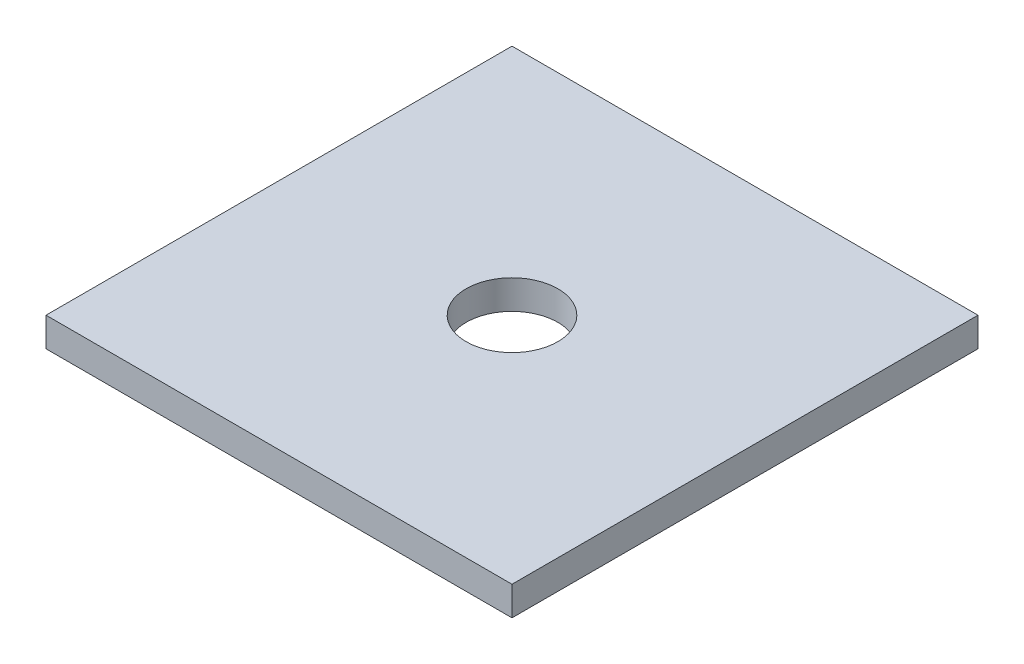
ISO-10303-21;
HEADER;
FILE_DESCRIPTION(('STEP AP214'),'2;1');
FILE_NAME('part.step','',(''),(''),'','','');
FILE_SCHEMA(('AUTOMOTIVE_DESIGN { 1 0 10303 214 1 1 1 1 }'));
ENDSEC;
DATA;
#1=APPLICATION_CONTEXT('core data for automotive mechanical design processes');
#2=APPLICATION_PROTOCOL_DEFINITION('international standard','automotive_design',2000,#1);
#3=PRODUCT_CONTEXT('',#1,'mechanical');
#4=PRODUCT('Part','Part','',(#3));
#5=PRODUCT_RELATED_PRODUCT_CATEGORY('part','',(#4));
#6=PRODUCT_DEFINITION_FORMATION('','',#4);
#7=PRODUCT_DEFINITION_CONTEXT('part definition',#1,'design');
#8=PRODUCT_DEFINITION('design','',#6,#7);
#9=PRODUCT_DEFINITION_SHAPE('','',#8);
#10=(LENGTH_UNIT() NAMED_UNIT(*) SI_UNIT(.MILLI.,.METRE.));
#11=(NAMED_UNIT(*) PLANE_ANGLE_UNIT() SI_UNIT($,.RADIAN.));
#12=(NAMED_UNIT(*) SI_UNIT($,.STERADIAN.) SOLID_ANGLE_UNIT());
#13=UNCERTAINTY_MEASURE_WITH_UNIT(LENGTH_MEASURE(1.E-05),#10,'distance_accuracy_value','');
#14=(GEOMETRIC_REPRESENTATION_CONTEXT(3) GLOBAL_UNCERTAINTY_ASSIGNED_CONTEXT((#13)) GLOBAL_UNIT_ASSIGNED_CONTEXT((#10,
#11,#12)) REPRESENTATION_CONTEXT('',''));
#15=CARTESIAN_POINT('',(0.,0.,0.));
#16=DIRECTION('',(0.,0.,1.));
#17=DIRECTION('',(1.,0.,0.));
#18=AXIS2_PLACEMENT_3D('',#15,#16,#17);
#19=CARTESIAN_POINT('',(0.,6.35,0.));
#20=DIRECTION('',(0.,1.,0.));
#21=DIRECTION('',(0.,0.,1.));
#22=AXIS2_PLACEMENT_3D('',#19,#20,#21);
#23=PLANE('',#22);
#24=DIRECTION('',(0.,0.,-1.));
#25=VECTOR('',#24,1.);
#26=CARTESIAN_POINT('',(50.8,6.35,-50.8));
#27=LINE('',#26,#25);
#28=CARTESIAN_POINT('',(50.8,6.35,50.8));
#29=VERTEX_POINT('',#28);
#30=CARTESIAN_POINT('',(50.8,6.35,-50.8));
#31=VERTEX_POINT('',#30);
#32=EDGE_CURVE('E85',#29,#31,#27,.T.);
#33=ORIENTED_EDGE('',*,*,#32,.T.);
#34=DIRECTION('',(-1.,0.,0.));
#35=VECTOR('',#34,1.);
#36=CARTESIAN_POINT('',(-50.8,6.35,-50.8));
#37=LINE('',#36,#35);
#38=CARTESIAN_POINT('',(-50.8,6.35,-50.8));
#39=VERTEX_POINT('',#38);
#40=EDGE_CURVE('E80',#31,#39,#37,.T.);
#41=ORIENTED_EDGE('',*,*,#40,.T.);
#42=DIRECTION('',(0.,0.,1.));
#43=VECTOR('',#42,1.);
#44=CARTESIAN_POINT('',(-50.8,6.35,-50.8));
#45=LINE('',#44,#43);
#46=CARTESIAN_POINT('',(-50.8,6.35,50.8));
#47=VERTEX_POINT('',#46);
#48=EDGE_CURVE('E83',#39,#47,#45,.T.);
#49=ORIENTED_EDGE('',*,*,#48,.T.);
#50=DIRECTION('',(1.,0.,0.));
#51=VECTOR('',#50,1.);
#52=CARTESIAN_POINT('',(-50.8,6.35,50.8));
#53=LINE('',#52,#51);
#54=EDGE_CURVE('E50',#47,#29,#53,.T.);
#55=ORIENTED_EDGE('',*,*,#54,.T.);
#56=EDGE_LOOP('',(#33,#41,#49,#55));
#57=FACE_BOUND('',#56,.T.);
#58=CARTESIAN_POINT('',(0.,6.35,0.));
#59=DIRECTION('',(0.,1.,0.));
#60=DIRECTION('',(0.,0.,1.));
#61=AXIS2_PLACEMENT_3D('',#58,#59,#60);
#62=CIRCLE('',#61,10.);
#63=CARTESIAN_POINT('',(0.,6.35,9.99999999999999));
#64=VERTEX_POINT('',#63);
#65=EDGE_CURVE('E100',#64,#64,#62,.T.);
#66=ORIENTED_EDGE('',*,*,#65,.F.);
#67=EDGE_LOOP('',(#66));
#68=FACE_BOUND('',#67,.T.);
#69=ADVANCED_FACE('F33',(#57,#68),#23,.T.);
#70=CARTESIAN_POINT('',(0.,0.,0.));
#71=DIRECTION('',(0.,1.,0.));
#72=DIRECTION('',(0.,0.,1.));
#73=AXIS2_PLACEMENT_3D('',#70,#71,#72);
#74=PLANE('',#73);
#75=DIRECTION('',(0.,0.,-1.));
#76=VECTOR('',#75,1.);
#77=CARTESIAN_POINT('',(50.8,0.,-50.8));
#78=LINE('',#77,#76);
#79=CARTESIAN_POINT('',(50.8,0.,50.8));
#80=VERTEX_POINT('',#79);
#81=CARTESIAN_POINT('',(50.8,0.,-50.8));
#82=VERTEX_POINT('',#81);
#83=EDGE_CURVE('E97',#80,#82,#78,.T.);
#84=ORIENTED_EDGE('',*,*,#83,.F.);
#85=DIRECTION('',(1.,0.,0.));
#86=VECTOR('',#85,1.);
#87=CARTESIAN_POINT('',(-50.8,0.,50.8));
#88=LINE('',#87,#86);
#89=CARTESIAN_POINT('',(-50.8,0.,50.8));
#90=VERTEX_POINT('',#89);
#91=EDGE_CURVE('E73',#90,#80,#88,.T.);
#92=ORIENTED_EDGE('',*,*,#91,.F.);
#93=DIRECTION('',(0.,0.,1.));
#94=VECTOR('',#93,1.);
#95=CARTESIAN_POINT('',(-50.8,0.,-50.8));
#96=LINE('',#95,#94);
#97=CARTESIAN_POINT('',(-50.8,0.,-50.8));
#98=VERTEX_POINT('',#97);
#99=EDGE_CURVE('E67',#98,#90,#96,.T.);
#100=ORIENTED_EDGE('',*,*,#99,.F.);
#101=DIRECTION('',(-1.,0.,0.));
#102=VECTOR('',#101,1.);
#103=CARTESIAN_POINT('',(-50.8,0.,-50.8));
#104=LINE('',#103,#102);
#105=EDGE_CURVE('E89',#82,#98,#104,.T.);
#106=ORIENTED_EDGE('',*,*,#105,.F.);
#107=EDGE_LOOP('',(#84,#92,#100,#106));
#108=FACE_BOUND('',#107,.T.);
#109=CARTESIAN_POINT('',(0.,0.,0.));
#110=DIRECTION('',(0.,1.,0.));
#111=DIRECTION('',(0.,0.,1.));
#112=AXIS2_PLACEMENT_3D('',#109,#110,#111);
#113=CIRCLE('',#112,10.);
#114=CARTESIAN_POINT('',(0.,0.,9.99999999999999));
#115=VERTEX_POINT('',#114);
#116=EDGE_CURVE('E112',#115,#115,#113,.T.);
#117=ORIENTED_EDGE('',*,*,#116,.T.);
#118=EDGE_LOOP('',(#117));
#119=FACE_BOUND('',#118,.T.);
#120=ADVANCED_FACE('F108',(#108,#119),#74,.F.);
#121=CARTESIAN_POINT('',(50.8,6.35,-50.8));
#122=DIRECTION('',(-1.,0.,0.));
#123=DIRECTION('',(0.,0.,1.));
#124=AXIS2_PLACEMENT_3D('',#121,#122,#123);
#125=PLANE('',#124);
#126=ORIENTED_EDGE('',*,*,#83,.T.);
#127=DIRECTION('',(0.,-1.,0.));
#128=VECTOR('',#127,1.);
#129=CARTESIAN_POINT('',(50.8,6.35,-50.8));
#130=LINE('',#129,#128);
#131=EDGE_CURVE('E11',#31,#82,#130,.T.);
#132=ORIENTED_EDGE('',*,*,#131,.F.);
#133=ORIENTED_EDGE('',*,*,#32,.F.);
#134=DIRECTION('',(0.,-1.,0.));
#135=VECTOR('',#134,1.);
#136=CARTESIAN_POINT('',(50.8,6.35,50.8));
#137=LINE('',#136,#135);
#138=EDGE_CURVE('E93',#29,#80,#137,.T.);
#139=ORIENTED_EDGE('',*,*,#138,.T.);
#140=EDGE_LOOP('',(#126,#132,#133,#139));
#141=FACE_BOUND('',#140,.T.);
#142=ADVANCED_FACE('F35',(#141),#125,.F.);
#143=CARTESIAN_POINT('',(-50.8,6.35,-50.8));
#144=DIRECTION('',(0.,0.,1.));
#145=DIRECTION('',(1.,0.,0.));
#146=AXIS2_PLACEMENT_3D('',#143,#144,#145);
#147=PLANE('',#146);
#148=ORIENTED_EDGE('',*,*,#105,.T.);
#149=DIRECTION('',(0.,-1.,0.));
#150=VECTOR('',#149,1.);
#151=CARTESIAN_POINT('',(-50.8,6.35,-50.8));
#152=LINE('',#151,#150);
#153=EDGE_CURVE('E42',#39,#98,#152,.T.);
#154=ORIENTED_EDGE('',*,*,#153,.F.);
#155=ORIENTED_EDGE('',*,*,#40,.F.);
#156=ORIENTED_EDGE('',*,*,#131,.T.);
#157=EDGE_LOOP('',(#148,#154,#155,#156));
#158=FACE_BOUND('',#157,.T.);
#159=ADVANCED_FACE('F88',(#158),#147,.F.);
#160=CARTESIAN_POINT('',(-50.8,6.35,-50.8));
#161=DIRECTION('',(1.,0.,0.));
#162=DIRECTION('',(0.,0.,-1.));
#163=AXIS2_PLACEMENT_3D('',#160,#161,#162);
#164=PLANE('',#163);
#165=ORIENTED_EDGE('',*,*,#99,.T.);
#166=DIRECTION('',(0.,-1.,0.));
#167=VECTOR('',#166,1.);
#168=CARTESIAN_POINT('',(-50.8,6.35,50.8));
#169=LINE('',#168,#167);
#170=EDGE_CURVE('E90',#47,#90,#169,.T.);
#171=ORIENTED_EDGE('',*,*,#170,.F.);
#172=ORIENTED_EDGE('',*,*,#48,.F.);
#173=ORIENTED_EDGE('',*,*,#153,.T.);
#174=EDGE_LOOP('',(#165,#171,#172,#173));
#175=FACE_BOUND('',#174,.T.);
#176=ADVANCED_FACE('F91',(#175),#164,.F.);
#177=CARTESIAN_POINT('',(-50.8,6.35,50.8));
#178=DIRECTION('',(0.,0.,-1.));
#179=DIRECTION('',(-1.,0.,0.));
#180=AXIS2_PLACEMENT_3D('',#177,#178,#179);
#181=PLANE('',#180);
#182=ORIENTED_EDGE('',*,*,#91,.T.);
#183=ORIENTED_EDGE('',*,*,#138,.F.);
#184=ORIENTED_EDGE('',*,*,#54,.F.);
#185=ORIENTED_EDGE('',*,*,#170,.T.);
#186=EDGE_LOOP('',(#182,#183,#184,#185));
#187=FACE_BOUND('',#186,.T.);
#188=ADVANCED_FACE('F105',(#187),#181,.F.);
#189=CARTESIAN_POINT('',(0.,6.35,0.));
#190=DIRECTION('',(0.,-1.,0.));
#191=DIRECTION('',(0.,0.,-1.));
#192=AXIS2_PLACEMENT_3D('',#189,#190,#191);
#193=CYLINDRICAL_SURFACE('',#192,10.);
#194=ORIENTED_EDGE('',*,*,#65,.T.);
#195=EDGE_LOOP('',(#194));
#196=FACE_BOUND('',#195,.T.);
#197=ORIENTED_EDGE('',*,*,#116,.F.);
#198=EDGE_LOOP('',(#197));
#199=FACE_BOUND('',#198,.T.);
#200=ADVANCED_FACE('F118',(#196,#199),#193,.F.);
#201=CLOSED_SHELL('',(#69,#120,#142,#159,#176,#188,#200));
#202=MANIFOLD_SOLID_BREP('B2',#201);
#203=ADVANCED_BREP_SHAPE_REPRESENTATION('',(#18,#202),#14);
#204=SHAPE_DEFINITION_REPRESENTATION(#9,#203);
ENDSEC;
END-ISO-10303-21;
